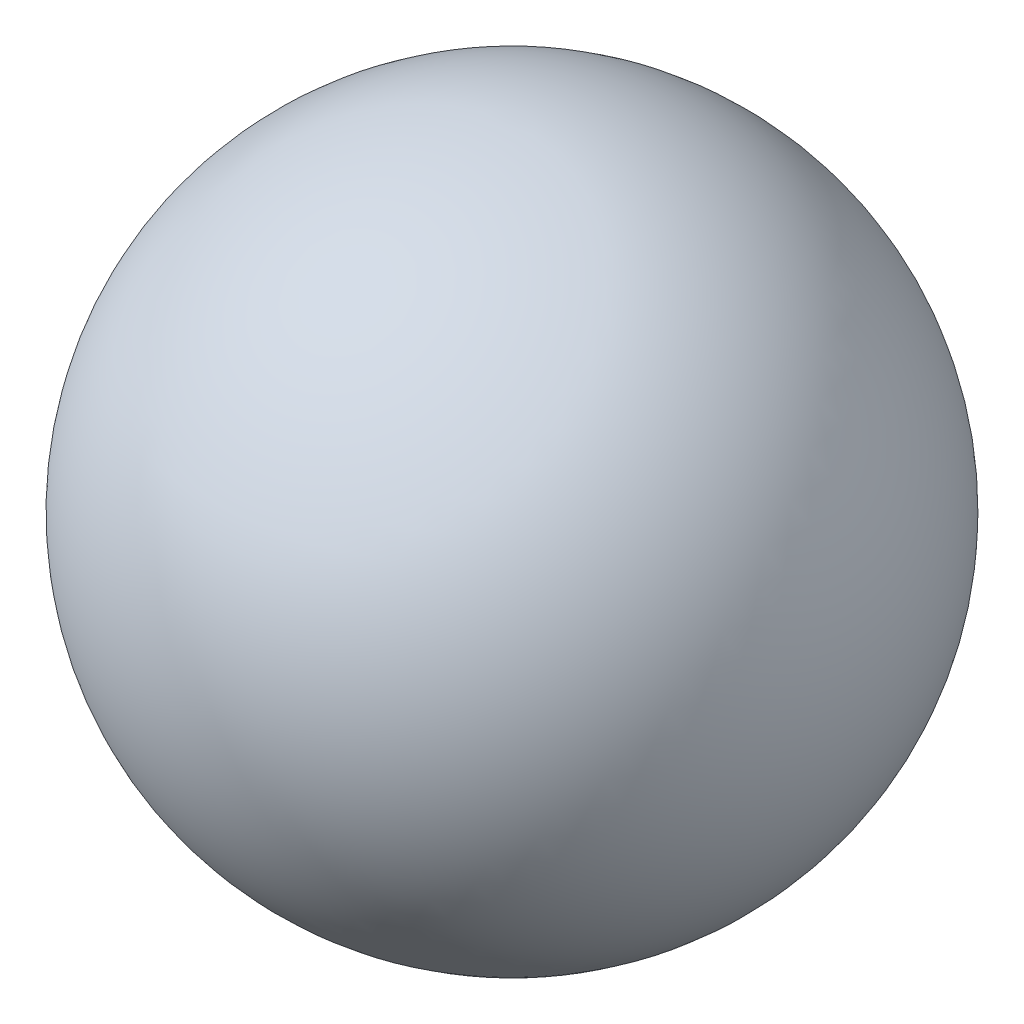
ISO-10303-21;
HEADER;
FILE_DESCRIPTION(('STEP AP214'),'2;1');
FILE_NAME('part.step','',(''),(''),'','','');
FILE_SCHEMA(('AUTOMOTIVE_DESIGN { 1 0 10303 214 1 1 1 1 }'));
ENDSEC;
DATA;
#1=APPLICATION_CONTEXT('core data for automotive mechanical design processes');
#2=APPLICATION_PROTOCOL_DEFINITION('international standard','automotive_design',2000,#1);
#3=PRODUCT_CONTEXT('',#1,'mechanical');
#4=PRODUCT('Part','Part','',(#3));
#5=PRODUCT_RELATED_PRODUCT_CATEGORY('part','',(#4));
#6=PRODUCT_DEFINITION_FORMATION('','',#4);
#7=PRODUCT_DEFINITION_CONTEXT('part definition',#1,'design');
#8=PRODUCT_DEFINITION('design','',#6,#7);
#9=PRODUCT_DEFINITION_SHAPE('','',#8);
#10=(LENGTH_UNIT() NAMED_UNIT(*) SI_UNIT(.MILLI.,.METRE.));
#11=(NAMED_UNIT(*) PLANE_ANGLE_UNIT() SI_UNIT($,.RADIAN.));
#12=(NAMED_UNIT(*) SI_UNIT($,.STERADIAN.) SOLID_ANGLE_UNIT());
#13=UNCERTAINTY_MEASURE_WITH_UNIT(LENGTH_MEASURE(1.E-05),#10,'distance_accuracy_value','');
#14=(GEOMETRIC_REPRESENTATION_CONTEXT(3) GLOBAL_UNCERTAINTY_ASSIGNED_CONTEXT((#13)) GLOBAL_UNIT_ASSIGNED_CONTEXT((#10,
#11,#12)) REPRESENTATION_CONTEXT('',''));
#15=CARTESIAN_POINT('',(0.,0.,0.));
#16=DIRECTION('',(0.,0.,1.));
#17=DIRECTION('',(1.,0.,0.));
#18=AXIS2_PLACEMENT_3D('',#15,#16,#17);
#19=CARTESIAN_POINT('',(0.,0.,0.));
#20=DIRECTION('',(0.0304105121502589,-0.999537493419211,0.));
#21=DIRECTION('',(0.999537493419211,0.0304105121502589,0.));
#22=AXIS2_PLACEMENT_3D('',#19,#20,#21);
#23=SPHERICAL_SURFACE('',#22,75.);
#24=CARTESIAN_POINT('',(2.28078841126942,-74.9653120064408,0.));
#25=VERTEX_POINT('',#24);
#26=VERTEX_LOOP('',#25);
#27=FACE_BOUND('',#26,.T.);
#28=ADVANCED_FACE('F37',(#27),#23,.T.);
#29=CLOSED_SHELL('',(#28));
#30=MANIFOLD_SOLID_BREP('B2',#29);
#31=ADVANCED_BREP_SHAPE_REPRESENTATION('',(#18,#30),#14);
#32=SHAPE_DEFINITION_REPRESENTATION(#9,#31);
ENDSEC;
END-ISO-10303-21;
